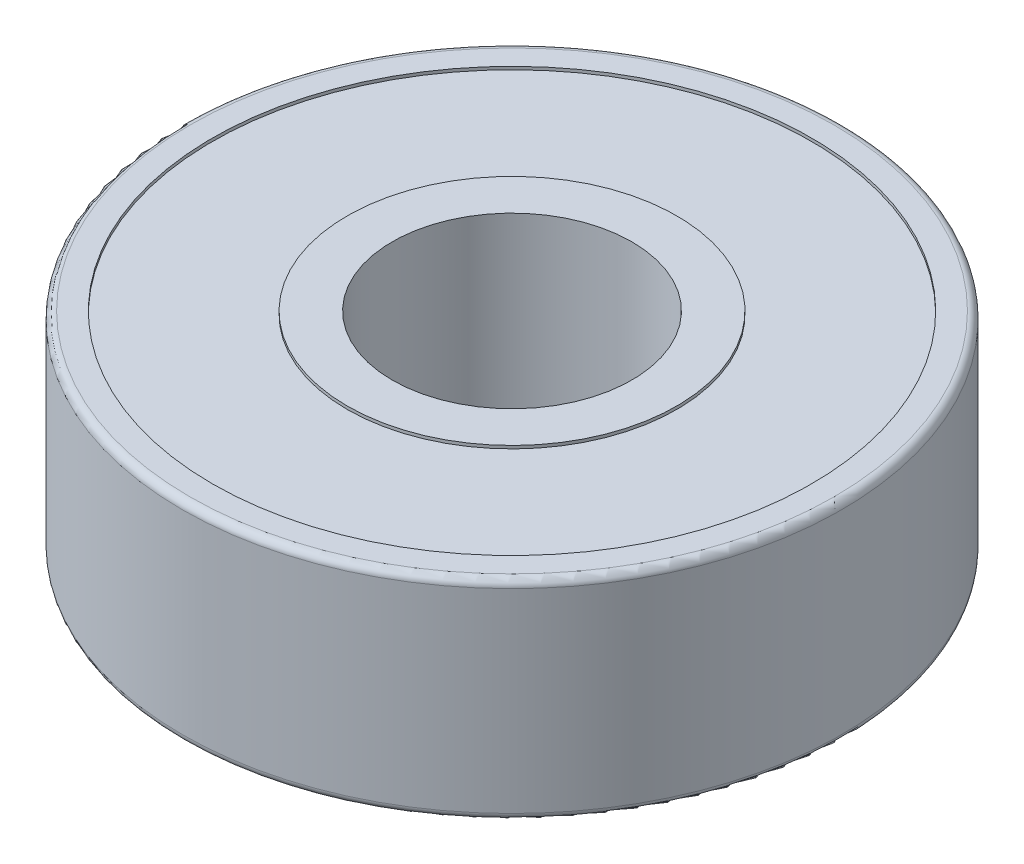
ISO-10303-21;
HEADER;
FILE_DESCRIPTION(('STEP AP214'),'2;1');
FILE_NAME('part.step','',(''),(''),'','','');
FILE_SCHEMA(('AUTOMOTIVE_DESIGN { 1 0 10303 214 1 1 1 1 }'));
ENDSEC;
DATA;
#1=APPLICATION_CONTEXT('core data for automotive mechanical design processes');
#2=APPLICATION_PROTOCOL_DEFINITION('international standard','automotive_design',2000,#1);
#3=PRODUCT_CONTEXT('',#1,'mechanical');
#4=PRODUCT('Part','Part','',(#3));
#5=PRODUCT_RELATED_PRODUCT_CATEGORY('part','',(#4));
#6=PRODUCT_DEFINITION_FORMATION('','',#4);
#7=PRODUCT_DEFINITION_CONTEXT('part definition',#1,'design');
#8=PRODUCT_DEFINITION('design','',#6,#7);
#9=PRODUCT_DEFINITION_SHAPE('','',#8);
#10=(LENGTH_UNIT() NAMED_UNIT(*) SI_UNIT(.MILLI.,.METRE.));
#11=(NAMED_UNIT(*) PLANE_ANGLE_UNIT() SI_UNIT($,.RADIAN.));
#12=(NAMED_UNIT(*) SI_UNIT($,.STERADIAN.) SOLID_ANGLE_UNIT());
#13=UNCERTAINTY_MEASURE_WITH_UNIT(LENGTH_MEASURE(1.E-05),#10,'distance_accuracy_value','');
#14=(GEOMETRIC_REPRESENTATION_CONTEXT(3) GLOBAL_UNCERTAINTY_ASSIGNED_CONTEXT((#13)) GLOBAL_UNIT_ASSIGNED_CONTEXT((#10,
#11,#12)) REPRESENTATION_CONTEXT('',''));
#15=CARTESIAN_POINT('',(0.,0.,0.));
#16=DIRECTION('',(0.,0.,1.));
#17=DIRECTION('',(1.,0.,0.));
#18=AXIS2_PLACEMENT_3D('',#15,#16,#17);
#19=CARTESIAN_POINT('',(0.,0.,0.));
#20=DIRECTION('',(0.,1.,0.));
#21=DIRECTION('',(0.,0.,1.));
#22=AXIS2_PLACEMENT_3D('',#19,#20,#21);
#23=PLANE('',#22);
#24=CARTESIAN_POINT('',(0.,0.,0.));
#25=DIRECTION('',(0.,1.,0.));
#26=DIRECTION('',(0.,0.,1.));
#27=AXIS2_PLACEMENT_3D('',#24,#25,#26);
#28=CIRCLE('',#27,4.);
#29=CARTESIAN_POINT('',(0.,0.,4.));
#30=VERTEX_POINT('',#29);
#31=EDGE_CURVE('E53',#30,#30,#28,.T.);
#32=ORIENTED_EDGE('',*,*,#31,.T.);
#33=EDGE_LOOP('',(#32));
#34=FACE_BOUND('',#33,.T.);
#35=CARTESIAN_POINT('',(0.,0.,0.));
#36=DIRECTION('',(0.,1.,0.));
#37=DIRECTION('',(0.,0.,1.));
#38=AXIS2_PLACEMENT_3D('',#35,#36,#37);
#39=CIRCLE('',#38,5.5);
#40=CARTESIAN_POINT('',(0.,0.,5.5));
#41=VERTEX_POINT('',#40);
#42=EDGE_CURVE('E77',#41,#41,#39,.T.);
#43=ORIENTED_EDGE('',*,*,#42,.F.);
#44=EDGE_LOOP('',(#43));
#45=FACE_BOUND('',#44,.T.);
#46=ADVANCED_FACE('F32',(#34,#45),#23,.F.);
#47=CARTESIAN_POINT('',(0.,7.,0.));
#48=DIRECTION('',(0.,1.,0.));
#49=DIRECTION('',(0.,0.,1.));
#50=AXIS2_PLACEMENT_3D('',#47,#48,#49);
#51=PLANE('',#50);
#52=CARTESIAN_POINT('',(0.,7.,0.));
#53=DIRECTION('',(0.,1.,0.));
#54=DIRECTION('',(0.,0.,1.));
#55=AXIS2_PLACEMENT_3D('',#52,#53,#54);
#56=CIRCLE('',#55,4.);
#57=CARTESIAN_POINT('',(0.,7.,4.));
#58=VERTEX_POINT('',#57);
#59=EDGE_CURVE('E52',#58,#58,#56,.T.);
#60=ORIENTED_EDGE('',*,*,#59,.F.);
#61=EDGE_LOOP('',(#60));
#62=FACE_BOUND('',#61,.T.);
#63=CARTESIAN_POINT('',(0.,7.,0.));
#64=DIRECTION('',(0.,1.,0.));
#65=DIRECTION('',(0.,0.,1.));
#66=AXIS2_PLACEMENT_3D('',#63,#64,#65);
#67=CIRCLE('',#66,5.5);
#68=CARTESIAN_POINT('',(0.,7.,5.5));
#69=VERTEX_POINT('',#68);
#70=EDGE_CURVE('E65',#69,#69,#67,.T.);
#71=ORIENTED_EDGE('',*,*,#70,.T.);
#72=EDGE_LOOP('',(#71));
#73=FACE_BOUND('',#72,.T.);
#74=ADVANCED_FACE('F94',(#62,#73),#51,.T.);
#75=CARTESIAN_POINT('',(0.,7.,0.));
#76=DIRECTION('',(0.,1.,0.));
#77=DIRECTION('',(0.,0.,1.));
#78=AXIS2_PLACEMENT_3D('',#75,#76,#77);
#79=CIRCLE('',#78,10.75);
#80=CARTESIAN_POINT('',(0.,7.,10.75));
#81=VERTEX_POINT('',#80);
#82=EDGE_CURVE('E10',#81,#81,#79,.T.);
#83=ORIENTED_EDGE('',*,*,#82,.T.);
#84=EDGE_LOOP('',(#83));
#85=FACE_BOUND('',#84,.T.);
#86=CARTESIAN_POINT('',(0.,7.,0.));
#87=DIRECTION('',(0.,1.,0.));
#88=DIRECTION('',(0.,0.,1.));
#89=AXIS2_PLACEMENT_3D('',#86,#87,#88);
#90=CIRCLE('',#89,10.);
#91=CARTESIAN_POINT('',(0.,7.,10.));
#92=VERTEX_POINT('',#91);
#93=EDGE_CURVE('E59',#92,#92,#90,.T.);
#94=ORIENTED_EDGE('',*,*,#93,.F.);
#95=EDGE_LOOP('',(#94));
#96=FACE_BOUND('',#95,.T.);
#97=ADVANCED_FACE('F101',(#85,#96),#51,.T.);
#98=CARTESIAN_POINT('',(0.,0.,0.));
#99=DIRECTION('',(0.,1.,0.));
#100=DIRECTION('',(0.,0.,1.));
#101=AXIS2_PLACEMENT_3D('',#98,#99,#100);
#102=CIRCLE('',#101,10.75);
#103=CARTESIAN_POINT('',(0.,0.,10.75));
#104=VERTEX_POINT('',#103);
#105=EDGE_CURVE('E39',#104,#104,#102,.F.);
#106=ORIENTED_EDGE('',*,*,#105,.T.);
#107=EDGE_LOOP('',(#106));
#108=FACE_BOUND('',#107,.T.);
#109=CARTESIAN_POINT('',(0.,0.,0.));
#110=DIRECTION('',(0.,1.,0.));
#111=DIRECTION('',(0.,0.,1.));
#112=AXIS2_PLACEMENT_3D('',#109,#110,#111);
#113=CIRCLE('',#112,10.);
#114=CARTESIAN_POINT('',(0.,0.,10.));
#115=VERTEX_POINT('',#114);
#116=EDGE_CURVE('E71',#115,#115,#113,.T.);
#117=ORIENTED_EDGE('',*,*,#116,.T.);
#118=EDGE_LOOP('',(#117));
#119=FACE_BOUND('',#118,.T.);
#120=ADVANCED_FACE('F97',(#108,#119),#23,.F.);
#121=CARTESIAN_POINT('',(0.,7.,0.));
#122=DIRECTION('',(0.,-1.,0.));
#123=DIRECTION('',(0.,0.,-1.));
#124=AXIS2_PLACEMENT_3D('',#121,#122,#123);
#125=CYLINDRICAL_SURFACE('',#124,11.);
#126=CARTESIAN_POINT('',(0.,0.25,0.));
#127=DIRECTION('',(0.,1.,0.));
#128=DIRECTION('',(0.,0.,1.));
#129=AXIS2_PLACEMENT_3D('',#126,#127,#128);
#130=CIRCLE('',#129,11.);
#131=CARTESIAN_POINT('',(0.,0.25,11.));
#132=VERTEX_POINT('',#131);
#133=EDGE_CURVE('E43',#132,#132,#130,.T.);
#134=ORIENTED_EDGE('',*,*,#133,.T.);
#135=EDGE_LOOP('',(#134));
#136=FACE_BOUND('',#135,.T.);
#137=CARTESIAN_POINT('',(0.,6.75,0.));
#138=DIRECTION('',(0.,1.,0.));
#139=DIRECTION('',(0.,0.,1.));
#140=AXIS2_PLACEMENT_3D('',#137,#138,#139);
#141=CIRCLE('',#140,11.);
#142=CARTESIAN_POINT('',(0.,6.75,11.));
#143=VERTEX_POINT('',#142);
#144=EDGE_CURVE('E47',#143,#143,#141,.F.);
#145=ORIENTED_EDGE('',*,*,#144,.T.);
#146=EDGE_LOOP('',(#145));
#147=FACE_BOUND('',#146,.T.);
#148=ADVANCED_FACE('F106',(#136,#147),#125,.T.);
#149=CARTESIAN_POINT('',(0.,7.,0.));
#150=DIRECTION('',(0.,-1.,0.));
#151=DIRECTION('',(0.,0.,-1.));
#152=AXIS2_PLACEMENT_3D('',#149,#150,#151);
#153=CYLINDRICAL_SURFACE('',#152,4.);
#154=ORIENTED_EDGE('',*,*,#59,.T.);
#155=EDGE_LOOP('',(#154));
#156=FACE_BOUND('',#155,.T.);
#157=ORIENTED_EDGE('',*,*,#31,.F.);
#158=EDGE_LOOP('',(#157));
#159=FACE_BOUND('',#158,.T.);
#160=ADVANCED_FACE('F111',(#156,#159),#153,.F.);
#161=CARTESIAN_POINT('',(0.,6.9,0.));
#162=DIRECTION('',(0.,1.,0.));
#163=DIRECTION('',(0.,0.,1.));
#164=AXIS2_PLACEMENT_3D('',#161,#162,#163);
#165=CYLINDRICAL_SURFACE('',#164,10.);
#166=CARTESIAN_POINT('',(0.,6.9,0.));
#167=DIRECTION('',(0.,1.,0.));
#168=DIRECTION('',(0.,0.,1.));
#169=AXIS2_PLACEMENT_3D('',#166,#167,#168);
#170=CIRCLE('',#169,10.);
#171=CARTESIAN_POINT('',(0.,6.9,10.));
#172=VERTEX_POINT('',#171);
#173=EDGE_CURVE('E56',#172,#172,#170,.T.);
#174=ORIENTED_EDGE('',*,*,#173,.F.);
#175=EDGE_LOOP('',(#174));
#176=FACE_BOUND('',#175,.T.);
#177=ORIENTED_EDGE('',*,*,#93,.T.);
#178=EDGE_LOOP('',(#177));
#179=FACE_BOUND('',#178,.T.);
#180=ADVANCED_FACE('F132',(#176,#179),#165,.F.);
#181=CARTESIAN_POINT('',(0.,6.9,0.));
#182=DIRECTION('',(0.,1.,0.));
#183=DIRECTION('',(0.,0.,1.));
#184=AXIS2_PLACEMENT_3D('',#181,#182,#183);
#185=PLANE('',#184);
#186=CARTESIAN_POINT('',(0.,6.9,0.));
#187=DIRECTION('',(0.,1.,0.));
#188=DIRECTION('',(0.,0.,1.));
#189=AXIS2_PLACEMENT_3D('',#186,#187,#188);
#190=CIRCLE('',#189,5.5);
#191=CARTESIAN_POINT('',(0.,6.9,5.5));
#192=VERTEX_POINT('',#191);
#193=EDGE_CURVE('E62',#192,#192,#190,.T.);
#194=ORIENTED_EDGE('',*,*,#193,.F.);
#195=EDGE_LOOP('',(#194));
#196=FACE_BOUND('',#195,.T.);
#197=ORIENTED_EDGE('',*,*,#173,.T.);
#198=EDGE_LOOP('',(#197));
#199=FACE_BOUND('',#198,.T.);
#200=ADVANCED_FACE('F128',(#196,#199),#185,.T.);
#201=CARTESIAN_POINT('',(0.,6.9,0.));
#202=DIRECTION('',(0.,1.,0.));
#203=DIRECTION('',(0.,0.,1.));
#204=AXIS2_PLACEMENT_3D('',#201,#202,#203);
#205=CYLINDRICAL_SURFACE('',#204,5.5);
#206=ORIENTED_EDGE('',*,*,#193,.T.);
#207=EDGE_LOOP('',(#206));
#208=FACE_BOUND('',#207,.T.);
#209=ORIENTED_EDGE('',*,*,#70,.F.);
#210=EDGE_LOOP('',(#209));
#211=FACE_BOUND('',#210,.T.);
#212=ADVANCED_FACE('F122',(#208,#211),#205,.T.);
#213=CARTESIAN_POINT('',(0.,0.1,0.));
#214=DIRECTION('',(0.,-1.,0.));
#215=DIRECTION('',(0.,0.,1.));
#216=AXIS2_PLACEMENT_3D('',#213,#214,#215);
#217=PLANE('',#216);
#218=CARTESIAN_POINT('',(0.,0.1,0.));
#219=DIRECTION('',(0.,1.,0.));
#220=DIRECTION('',(0.,0.,1.));
#221=AXIS2_PLACEMENT_3D('',#218,#219,#220);
#222=CIRCLE('',#221,10.);
#223=CARTESIAN_POINT('',(0.,0.1,10.));
#224=VERTEX_POINT('',#223);
#225=EDGE_CURVE('E68',#224,#224,#222,.T.);
#226=ORIENTED_EDGE('',*,*,#225,.F.);
#227=EDGE_LOOP('',(#226));
#228=FACE_BOUND('',#227,.T.);
#229=CARTESIAN_POINT('',(0.,0.1,0.));
#230=DIRECTION('',(0.,1.,0.));
#231=DIRECTION('',(0.,0.,1.));
#232=AXIS2_PLACEMENT_3D('',#229,#230,#231);
#233=CIRCLE('',#232,5.5);
#234=CARTESIAN_POINT('',(0.,0.1,5.5));
#235=VERTEX_POINT('',#234);
#236=EDGE_CURVE('E74',#235,#235,#233,.T.);
#237=ORIENTED_EDGE('',*,*,#236,.T.);
#238=EDGE_LOOP('',(#237));
#239=FACE_BOUND('',#238,.T.);
#240=ADVANCED_FACE('F83',(#228,#239),#217,.T.);
#241=CARTESIAN_POINT('',(0.,0.1,0.));
#242=DIRECTION('',(0.,-1.,0.));
#243=DIRECTION('',(0.,0.,-1.));
#244=AXIS2_PLACEMENT_3D('',#241,#242,#243);
#245=CYLINDRICAL_SURFACE('',#244,10.);
#246=ORIENTED_EDGE('',*,*,#225,.T.);
#247=EDGE_LOOP('',(#246));
#248=FACE_BOUND('',#247,.T.);
#249=ORIENTED_EDGE('',*,*,#116,.F.);
#250=EDGE_LOOP('',(#249));
#251=FACE_BOUND('',#250,.T.);
#252=ADVANCED_FACE('F89',(#248,#251),#245,.F.);
#253=CARTESIAN_POINT('',(0.,0.1,0.));
#254=DIRECTION('',(0.,-1.,0.));
#255=DIRECTION('',(0.,0.,-1.));
#256=AXIS2_PLACEMENT_3D('',#253,#254,#255);
#257=CYLINDRICAL_SURFACE('',#256,5.5);
#258=ORIENTED_EDGE('',*,*,#236,.F.);
#259=EDGE_LOOP('',(#258));
#260=FACE_BOUND('',#259,.T.);
#261=ORIENTED_EDGE('',*,*,#42,.T.);
#262=EDGE_LOOP('',(#261));
#263=FACE_BOUND('',#262,.T.);
#264=ADVANCED_FACE('F85',(#260,#263),#257,.T.);
#265=CARTESIAN_POINT('',(0.,0.25,0.));
#266=DIRECTION('',(0.,1.,0.));
#267=DIRECTION('',(0.,0.,1.));
#268=AXIS2_PLACEMENT_3D('',#265,#266,#267);
#269=TOROIDAL_SURFACE('',#268,10.75,0.25);
#270=ORIENTED_EDGE('',*,*,#105,.F.);
#271=EDGE_LOOP('',(#270));
#272=FACE_BOUND('',#271,.T.);
#273=ORIENTED_EDGE('',*,*,#133,.F.);
#274=EDGE_LOOP('',(#273));
#275=FACE_BOUND('',#274,.T.);
#276=ADVANCED_FACE('F88',(#272,#275),#269,.T.);
#277=CARTESIAN_POINT('',(0.,6.75,0.));
#278=DIRECTION('',(0.,1.,0.));
#279=DIRECTION('',(0.,0.,1.));
#280=AXIS2_PLACEMENT_3D('',#277,#278,#279);
#281=TOROIDAL_SURFACE('',#280,10.75,0.25);
#282=ORIENTED_EDGE('',*,*,#144,.F.);
#283=EDGE_LOOP('',(#282));
#284=FACE_BOUND('',#283,.T.);
#285=ORIENTED_EDGE('',*,*,#82,.F.);
#286=EDGE_LOOP('',(#285));
#287=FACE_BOUND('',#286,.T.);
#288=ADVANCED_FACE('F34',(#284,#287),#281,.T.);
#289=CLOSED_SHELL('',(#46,#74,#97,#120,#148,#160,#180,#200,#212,#240,#252,#264,#276,#288));
#290=MANIFOLD_SOLID_BREP('B2',#289);
#291=ADVANCED_BREP_SHAPE_REPRESENTATION('',(#18,#290),#14);
#292=SHAPE_DEFINITION_REPRESENTATION(#9,#291);
ENDSEC;
END-ISO-10303-21;
